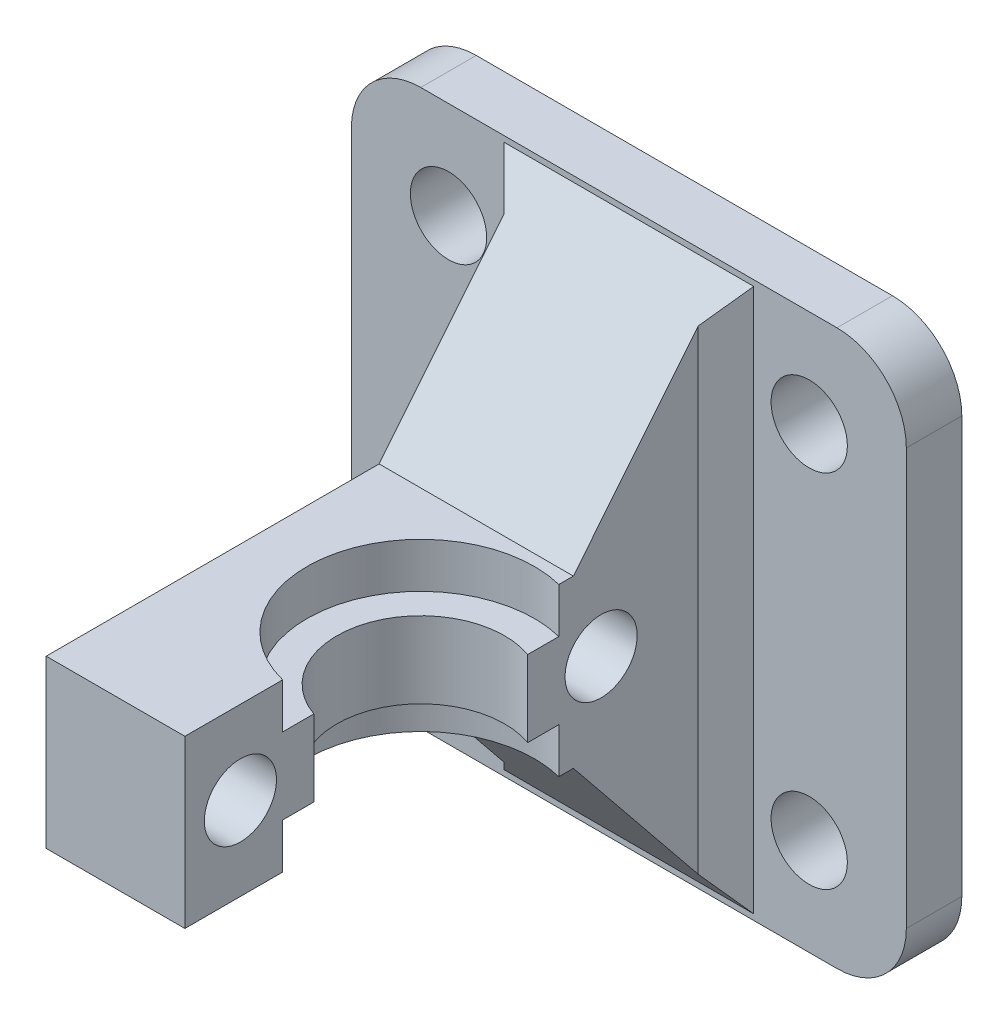
ISO-10303-21;
HEADER;
FILE_DESCRIPTION(('STEP AP214'),'2;1');
FILE_NAME('part.step','',(''),(''),'','','');
FILE_SCHEMA(('AUTOMOTIVE_DESIGN { 1 0 10303 214 1 1 1 1 }'));
ENDSEC;
DATA;
#1=APPLICATION_CONTEXT('core data for automotive mechanical design processes');
#2=APPLICATION_PROTOCOL_DEFINITION('international standard','automotive_design',2000,#1);
#3=PRODUCT_CONTEXT('',#1,'mechanical');
#4=PRODUCT('Part','Part','',(#3));
#5=PRODUCT_RELATED_PRODUCT_CATEGORY('part','',(#4));
#6=PRODUCT_DEFINITION_FORMATION('','',#4);
#7=PRODUCT_DEFINITION_CONTEXT('part definition',#1,'design');
#8=PRODUCT_DEFINITION('design','',#6,#7);
#9=PRODUCT_DEFINITION_SHAPE('','',#8);
#10=(LENGTH_UNIT() NAMED_UNIT(*) SI_UNIT(.MILLI.,.METRE.));
#11=(NAMED_UNIT(*) PLANE_ANGLE_UNIT() SI_UNIT($,.RADIAN.));
#12=(NAMED_UNIT(*) SI_UNIT($,.STERADIAN.) SOLID_ANGLE_UNIT());
#13=UNCERTAINTY_MEASURE_WITH_UNIT(LENGTH_MEASURE(1.E-05),#10,'distance_accuracy_value','');
#14=(GEOMETRIC_REPRESENTATION_CONTEXT(3) GLOBAL_UNCERTAINTY_ASSIGNED_CONTEXT((#13)) GLOBAL_UNIT_ASSIGNED_CONTEXT((#10,
#11,#12)) REPRESENTATION_CONTEXT('',''));
#15=CARTESIAN_POINT('',(0.,0.,0.));
#16=DIRECTION('',(0.,0.,1.));
#17=DIRECTION('',(1.,0.,0.));
#18=AXIS2_PLACEMENT_3D('',#15,#16,#17);
#19=CARTESIAN_POINT('',(5.,6.,24.));
#20=DIRECTION('',(0.,-1.,0.));
#21=DIRECTION('',(0.,0.,-1.));
#22=AXIS2_PLACEMENT_3D('',#19,#20,#21);
#23=CYLINDRICAL_SURFACE('',#22,8.2);
#24=CARTESIAN_POINT('',(5.,-2.75,24.));
#25=DIRECTION('',(0.,1.,0.));
#26=DIRECTION('',(0.,0.,1.));
#27=AXIS2_PLACEMENT_3D('',#24,#25,#26);
#28=CIRCLE('',#27,8.2);
#29=CARTESIAN_POINT('',(3.00000000000001,-2.75,31.9523581408284));
#30=VERTEX_POINT('',#29);
#31=CARTESIAN_POINT('',(7.,-2.75,16.0476418591716));
#32=VERTEX_POINT('',#31);
#33=EDGE_CURVE('E204',#30,#32,#28,.F.);
#34=ORIENTED_EDGE('',*,*,#33,.F.);
#35=DIRECTION('',(0.,-1.,0.));
#36=VECTOR('',#35,1.);
#37=CARTESIAN_POINT('',(3.00000000000001,6.,31.9523581408284));
#38=LINE('',#37,#36);
#39=CARTESIAN_POINT('',(3.00000000000001,-6.,31.9523581408284));
#40=VERTEX_POINT('',#39);
#41=EDGE_CURVE('E261',#30,#40,#38,.T.);
#42=ORIENTED_EDGE('',*,*,#41,.T.);
#43=CARTESIAN_POINT('',(5.,-6.,24.));
#44=DIRECTION('',(0.,-1.,0.));
#45=DIRECTION('',(0.,0.,1.));
#46=AXIS2_PLACEMENT_3D('',#43,#44,#45);
#47=CIRCLE('',#46,8.2);
#48=CARTESIAN_POINT('',(7.,-6.,16.0476418591716));
#49=VERTEX_POINT('',#48);
#50=EDGE_CURVE('E253',#40,#49,#47,.T.);
#51=ORIENTED_EDGE('',*,*,#50,.T.);
#52=DIRECTION('',(0.,-1.,0.));
#53=VECTOR('',#52,1.);
#54=CARTESIAN_POINT('',(7.,6.,16.0476418591716));
#55=LINE('',#54,#53);
#56=EDGE_CURVE('E246',#32,#49,#55,.T.);
#57=ORIENTED_EDGE('',*,*,#56,.F.);
#58=EDGE_LOOP('',(#34,#42,#51,#57));
#59=FACE_BOUND('',#58,.T.);
#60=ADVANCED_FACE('F33',(#59),#23,.F.);
#61=CARTESIAN_POINT('',(-7.,0.,13.));
#62=DIRECTION('',(1.,0.,0.));
#63=DIRECTION('',(0.,0.,-1.));
#64=AXIS2_PLACEMENT_3D('',#61,#62,#63);
#65=CYLINDRICAL_SURFACE('',#64,2.6);
#66=CARTESIAN_POINT('',(-7.,0.,13.));
#67=DIRECTION('',(1.,0.,0.));
#68=DIRECTION('',(0.,0.,-1.));
#69=AXIS2_PLACEMENT_3D('',#66,#67,#68);
#70=CIRCLE('',#69,2.6);
#71=CARTESIAN_POINT('',(-7.,0.,10.4));
#72=VERTEX_POINT('',#71);
#73=EDGE_CURVE('E227',#72,#72,#70,.T.);
#74=ORIENTED_EDGE('',*,*,#73,.F.);
#75=EDGE_LOOP('',(#74));
#76=FACE_BOUND('',#75,.T.);
#77=CARTESIAN_POINT('',(7.,0.,13.));
#78=DIRECTION('',(1.,0.,0.));
#79=DIRECTION('',(0.,0.,-1.));
#80=AXIS2_PLACEMENT_3D('',#77,#78,#79);
#81=CIRCLE('',#80,2.6);
#82=CARTESIAN_POINT('',(7.,0.,10.4));
#83=VERTEX_POINT('',#82);
#84=EDGE_CURVE('E231',#83,#83,#81,.T.);
#85=ORIENTED_EDGE('',*,*,#84,.T.);
#86=EDGE_LOOP('',(#85));
#87=FACE_BOUND('',#86,.T.);
#88=CARTESIAN_POINT('',(3.70000000000004,0.,15.6));
#89=CARTESIAN_POINT('',(3.70000266711035,0.0246446385520677,15.5999994858206));
#90=CARTESIAN_POINT('',(3.70228665332227,0.0493029766518838,15.5996451391014));
#91=CARTESIAN_POINT('',(3.7111974815542,0.0978061832979912,15.5982735696307));
#92=CARTESIAN_POINT('',(3.71782939200899,0.121650068254081,15.5972555732615));
#93=CARTESIAN_POINT('',(3.73478093359689,0.167721413711001,15.5946866605523));
#94=CARTESIAN_POINT('',(3.74507166867469,0.18995994235702,15.5931399235997));
#95=CARTESIAN_POINT('',(3.76865895936663,0.23272295071679,15.5896526800661));
#96=CARTESIAN_POINT('',(3.78195654391533,0.253246840386271,15.5877120387155));
#97=CARTESIAN_POINT('',(3.82032584808766,0.305253555135389,15.5822245452235));
#98=CARTESIAN_POINT('',(3.84743823797105,0.335204653877232,15.5784526270009));
#99=CARTESIAN_POINT('',(3.90594045527389,0.390554954343029,15.5706514688819));
#100=CARTESIAN_POINT('',(3.93734337494103,0.415939650404897,15.566621462258));
#101=CARTESIAN_POINT('',(4.02515134468757,0.478472467646816,15.555907024401));
#102=CARTESIAN_POINT('',(4.08412697352073,0.511997711192338,15.5492666925414));
#103=CARTESIAN_POINT('',(4.20635063739925,0.570056355504465,15.5369066139386));
#104=CARTESIAN_POINT('',(4.26960732409404,0.594570862394637,15.5311888154973));
#105=CARTESIAN_POINT('',(4.44149399094251,0.65004419576083,15.5176895771876));
#106=CARTESIAN_POINT('',(4.55233408181402,0.674454695045524,15.5110628594));
#107=CARTESIAN_POINT('',(4.7766314996914,0.706608431328433,15.5021860240456));
#108=CARTESIAN_POINT('',(4.89009537969944,0.714304017630115,15.4999484206722));
#109=CARTESIAN_POINT('',(5.12229324478594,0.71396883979046,15.5000554958552));
#110=CARTESIAN_POINT('',(5.24103209177177,0.705206499796562,15.5026133283509));
#111=CARTESIAN_POINT('',(5.41652582320383,0.6781764213266,15.5100087137989));
#112=CARTESIAN_POINT('',(5.47449062289461,0.66688321653117,15.5130586724157));
#113=CARTESIAN_POINT('',(5.58910378443032,0.639198328721435,15.5202455099649));
#114=CARTESIAN_POINT('',(5.64575334433879,0.622811498438386,15.5243813537871));
#115=CARTESIAN_POINT('',(5.74857198642842,0.587138068771593,15.5328937628555));
#116=CARTESIAN_POINT('',(5.79503164697384,0.568663334269773,15.5371396087686));
#117=CARTESIAN_POINT('',(5.88579619989819,0.526820491825865,15.5461580607854));
#118=CARTESIAN_POINT('',(5.93009690279299,0.503443302846257,15.5509316365575));
#119=CARTESIAN_POINT('',(6.01574848190205,0.450613010832115,15.5607977001414));
#120=CARTESIAN_POINT('',(6.05705358677998,0.421084955973537,15.5658935240709));
#121=CARTESIAN_POINT('',(6.13369806208265,0.355066674843864,15.5758560511966));
#122=CARTESIAN_POINT('',(6.16906584958734,0.318611502706494,15.580723760424));
#123=CARTESIAN_POINT('',(6.21524615531826,0.257468421027484,15.5873048949636));
#124=CARTESIAN_POINT('',(6.22968243270645,0.235566068968109,15.5894085906244));
#125=CARTESIAN_POINT('',(6.25510879554287,0.189787058994486,15.5931655494481));
#126=CARTESIAN_POINT('',(6.26610121078474,0.165911749676084,15.5948191170257));
#127=CARTESIAN_POINT('',(6.28388688228515,0.116301470061408,15.5975171316654));
#128=CARTESIAN_POINT('',(6.29063612343278,0.0905500027884597,15.5985551878422));
#129=CARTESIAN_POINT('',(6.29904058249715,0.0382106245730077,15.5998504050423));
#130=CARTESIAN_POINT('',(6.30070104639114,0.0116236035892148,15.6001083702512));
#131=CARTESIAN_POINT('',(6.29887056882852,-0.0380731569205889,15.5998253253242));
#132=CARTESIAN_POINT('',(6.29598820081816,-0.0612083206831745,15.5993786975264));
#133=CARTESIAN_POINT('',(6.28643813542854,-0.106660739262427,15.5979109788073));
#134=CARTESIAN_POINT('',(6.27976842690653,-0.12897755281286,15.5968895826769));
#135=CARTESIAN_POINT('',(6.26101576181098,-0.177859143658967,15.594052748741));
#136=CARTESIAN_POINT('',(6.24798432530818,-0.204049582857031,15.592101002369));
#137=CARTESIAN_POINT('',(6.21789815965699,-0.253949305314392,15.5876902125312));
#138=CARTESIAN_POINT('',(6.20083612848259,-0.277653971341187,15.5852302493814));
#139=CARTESIAN_POINT('',(6.15453441868819,-0.333627827481036,15.5787277714951));
#140=CARTESIAN_POINT('',(6.12344521303143,-0.364335233239077,15.5745042451843));
#141=CARTESIAN_POINT('',(6.05698337493439,-0.420630820405962,15.5659070513656));
#142=CARTESIAN_POINT('',(6.02160064247138,-0.446206540238347,15.5615330478818));
#143=CARTESIAN_POINT('',(5.92213134412991,-0.509411670240929,15.5499336673464));
#144=CARTESIAN_POINT('',(5.85537805042234,-0.542846011862888,15.5428694577233));
#145=CARTESIAN_POINT('',(5.71768049284909,-0.599658985099565,15.5300667977269));
#146=CARTESIAN_POINT('',(5.64672803788713,-0.623017173688397,15.5243310534235));
#147=CARTESIAN_POINT('',(5.51670520338476,-0.657572868652399,15.5155208162479));
#148=CARTESIAN_POINT('',(5.45804161556919,-0.670258406185354,15.5121448070635));
#149=CARTESIAN_POINT('',(5.33980979546832,-0.690741344057659,15.5065880688304));
#150=CARTESIAN_POINT('',(5.28024110858591,-0.698536198876264,15.5044079623038));
#151=CARTESIAN_POINT('',(5.10044123600596,-0.715137062163548,15.499750618356));
#152=CARTESIAN_POINT('',(4.97942801978185,-0.717081836711884,15.4991779653655));
#153=CARTESIAN_POINT('',(4.79698794200043,-0.706407605688524,15.5021950705903));
#154=CARTESIAN_POINT('',(4.73504050665241,-0.700375530704898,15.5039061798466));
#155=CARTESIAN_POINT('',(4.61190487087694,-0.683228763101747,15.5086419900749));
#156=CARTESIAN_POINT('',(4.55071625158819,-0.672117015574107,15.5116659298432));
#157=CARTESIAN_POINT('',(4.43005436525828,-0.644413257281783,15.5189153544298));
#158=CARTESIAN_POINT('',(4.37057283403123,-0.627855540388093,15.5231332978862));
#159=CARTESIAN_POINT('',(4.25385495532783,-0.588470701840785,15.5326110043088));
#160=CARTESIAN_POINT('',(4.19661472162409,-0.565655036050854,15.5378688587451));
#161=CARTESIAN_POINT('',(4.10589247018947,-0.522180572291755,15.5470810797948));
#162=CARTESIAN_POINT('',(4.07132543186498,-0.503742575664736,15.5508162531238));
#163=CARTESIAN_POINT('',(4.00423513743781,-0.463362068038479,15.5584604683142));
#164=CARTESIAN_POINT('',(3.97171401903171,-0.441415973623528,15.5623696849777));
#165=CARTESIAN_POINT('',(3.90939509969128,-0.393304192473495,15.5701971519027));
#166=CARTESIAN_POINT('',(3.87962686596363,-0.367099537587357,15.5741151201549));
#167=CARTESIAN_POINT('',(3.82473921050896,-0.310131578920839,15.5815960872351));
#168=CARTESIAN_POINT('',(3.79960800705441,-0.279380196204407,15.5851599747578));
#169=CARTESIAN_POINT('',(3.76413655062274,-0.225227087124255,15.5903127405192));
#170=CARTESIAN_POINT('',(3.75173702375318,-0.203202245365268,15.5921492339267));
#171=CARTESIAN_POINT('',(3.73051096100129,-0.157465050800809,15.5953279095812));
#172=CARTESIAN_POINT('',(3.72167775420576,-0.133755947113204,15.5966710142987));
#173=CARTESIAN_POINT('',(3.7100767482343,-0.0916532261959274,15.5984452222065));
#174=CARTESIAN_POINT('',(3.70631804463677,-0.0735368951870844,15.5990242474313));
#175=CARTESIAN_POINT('',(3.70127857406311,-0.036949628459925,15.5998018439192));
#176=CARTESIAN_POINT('',(3.69999800018826,-0.0184786652211387,15.6000003855341));
#177=CARTESIAN_POINT('',(3.70000000000004,0.,15.6));
#178=B_SPLINE_CURVE_WITH_KNOTS('',3,(#88,#89,#90,#91,#92,#93,#94,#95,#96,#97,#98,#99,#100,#101,
#102,#103,#104,#105,#106,#107,#108,#109,#110,#111,#112,#113,#114,#115,#116,#117,#118,#119,#120,
#121,#122,#123,#124,#125,#126,#127,#128,#129,#130,#131,#132,#133,#134,#135,#136,#137,#138,#139,
#140,#141,#142,#143,#144,#145,#146,#147,#148,#149,#150,#151,#152,#153,#154,#155,#156,#157,#158,
#159,#160,#161,#162,#163,#164,#165,#166,#167,#168,#169,#170,#171,#172,#173,#174,#175,#176,#177),
.UNSPECIFIED.,.T.,.F.,(4,2,2,2,2,2,2,2,2,2,2,2,2,2,2,2,2,2,2,2,2,2,2,2,2,2,2,2,2,2,2,2,2,2,2,2,
2,2,2,2,2,2,2,2,4),(0.,0.0738559209400195,0.147798090186888,0.221168809397196,0.294564673938246,
0.415591611305624,0.5369964639744,0.740334957731089,0.944097415419544,1.28330637190744,
1.62348107937878,1.97913570584439,2.15635512205151,2.33340621495194,2.48371439072381,
2.63430348804519,2.78684792182428,2.9386400391484,3.01734655899313,3.09599971784728,
3.17545585083391,3.25483004556811,3.32444001364924,3.39408698043023,3.48155640916668,
3.5691855338482,3.70014981419978,3.83142837309955,4.05515514549684,4.27933371570412,
4.45943339526073,4.63962673617629,5.00096902586841,5.1876029674382,5.37412883937237,
5.55950193294432,5.74453791981373,5.86243992775728,5.98046314780498,6.09963439825919,
6.2184985595714,6.2942727831185,6.36990460452187,6.42527780475544,6.48065531961597),.UNSPECIFIED.);
#179=CARTESIAN_POINT('',(3.70000000000004,0.,15.6));
#180=VERTEX_POINT('',#179);
#181=EDGE_CURVE('E334',#180,#180,#178,.T.);
#182=ORIENTED_EDGE('',*,*,#181,.F.);
#183=EDGE_LOOP('',(#182));
#184=FACE_BOUND('',#183,.T.);
#185=ADVANCED_FACE('F345',(#76,#87,#184),#65,.F.);
#186=CARTESIAN_POINT('',(20.,20.,4.));
#187=DIRECTION('',(-1.,0.,0.));
#188=DIRECTION('',(0.,-1.,0.));
#189=AXIS2_PLACEMENT_3D('',#186,#187,#188);
#190=PLANE('',#189);
#191=DIRECTION('',(0.,1.,0.));
#192=VECTOR('',#191,1.);
#193=CARTESIAN_POINT('',(20.,20.,4.));
#194=LINE('',#193,#192);
#195=CARTESIAN_POINT('',(20.,-15.,4.));
#196=VERTEX_POINT('',#195);
#197=CARTESIAN_POINT('',(20.,15.,4.));
#198=VERTEX_POINT('',#197);
#199=EDGE_CURVE('E295',#196,#198,#194,.T.);
#200=ORIENTED_EDGE('',*,*,#199,.F.);
#201=DIRECTION('',(0.,0.,-1.));
#202=VECTOR('',#201,1.);
#203=CARTESIAN_POINT('',(20.,-15.,4.));
#204=LINE('',#203,#202);
#205=CARTESIAN_POINT('',(20.,-15.,0.));
#206=VERTEX_POINT('',#205);
#207=EDGE_CURVE('E465',#196,#206,#204,.T.);
#208=ORIENTED_EDGE('',*,*,#207,.T.);
#209=DIRECTION('',(0.,1.,0.));
#210=VECTOR('',#209,1.);
#211=CARTESIAN_POINT('',(20.,20.,0.));
#212=LINE('',#211,#210);
#213=CARTESIAN_POINT('',(20.,15.,0.));
#214=VERTEX_POINT('',#213);
#215=EDGE_CURVE('E294',#206,#214,#212,.T.);
#216=ORIENTED_EDGE('',*,*,#215,.T.);
#217=DIRECTION('',(0.,0.,-1.));
#218=VECTOR('',#217,1.);
#219=CARTESIAN_POINT('',(20.,15.,4.));
#220=LINE('',#219,#218);
#221=EDGE_CURVE('E463',#214,#198,#220,.F.);
#222=ORIENTED_EDGE('',*,*,#221,.T.);
#223=EDGE_LOOP('',(#200,#208,#216,#222));
#224=FACE_BOUND('',#223,.T.);
#225=ADVANCED_FACE('F374',(#224),#190,.F.);
#226=CARTESIAN_POINT('',(-20.,20.,4.));
#227=DIRECTION('',(0.,-1.,0.));
#228=DIRECTION('',(0.,0.,-1.));
#229=AXIS2_PLACEMENT_3D('',#226,#227,#228);
#230=PLANE('',#229);
#231=DIRECTION('',(-1.,0.,0.));
#232=VECTOR('',#231,1.);
#233=CARTESIAN_POINT('',(-20.,20.,4.));
#234=LINE('',#233,#232);
#235=CARTESIAN_POINT('',(15.,20.,4.));
#236=VERTEX_POINT('',#235);
#237=CARTESIAN_POINT('',(-15.,20.,4.));
#238=VERTEX_POINT('',#237);
#239=EDGE_CURVE('E297',#236,#238,#234,.T.);
#240=ORIENTED_EDGE('',*,*,#239,.F.);
#241=DIRECTION('',(0.,0.,-1.));
#242=VECTOR('',#241,1.);
#243=CARTESIAN_POINT('',(15.,20.,4.));
#244=LINE('',#243,#242);
#245=CARTESIAN_POINT('',(15.,20.,0.));
#246=VERTEX_POINT('',#245);
#247=EDGE_CURVE('E11',#236,#246,#244,.T.);
#248=ORIENTED_EDGE('',*,*,#247,.T.);
#249=DIRECTION('',(-1.,0.,0.));
#250=VECTOR('',#249,1.);
#251=CARTESIAN_POINT('',(-20.,20.,0.));
#252=LINE('',#251,#250);
#253=CARTESIAN_POINT('',(-15.,20.,0.));
#254=VERTEX_POINT('',#253);
#255=EDGE_CURVE('E309',#246,#254,#252,.T.);
#256=ORIENTED_EDGE('',*,*,#255,.T.);
#257=DIRECTION('',(0.,0.,-1.));
#258=VECTOR('',#257,1.);
#259=CARTESIAN_POINT('',(-15.,20.,4.));
#260=LINE('',#259,#258);
#261=EDGE_CURVE('E41',#254,#238,#260,.F.);
#262=ORIENTED_EDGE('',*,*,#261,.T.);
#263=EDGE_LOOP('',(#240,#248,#256,#262));
#264=FACE_BOUND('',#263,.T.);
#265=ADVANCED_FACE('F481',(#264),#230,.F.);
#266=CARTESIAN_POINT('',(-20.,20.,4.));
#267=DIRECTION('',(1.,0.,0.));
#268=DIRECTION('',(0.,1.,0.));
#269=AXIS2_PLACEMENT_3D('',#266,#267,#268);
#270=PLANE('',#269);
#271=DIRECTION('',(0.,-1.,0.));
#272=VECTOR('',#271,1.);
#273=CARTESIAN_POINT('',(-20.,20.,0.));
#274=LINE('',#273,#272);
#275=CARTESIAN_POINT('',(-20.,15.,0.));
#276=VERTEX_POINT('',#275);
#277=CARTESIAN_POINT('',(-20.,-15.,0.));
#278=VERTEX_POINT('',#277);
#279=EDGE_CURVE('E311',#276,#278,#274,.T.);
#280=ORIENTED_EDGE('',*,*,#279,.T.);
#281=DIRECTION('',(0.,0.,-1.));
#282=VECTOR('',#281,1.);
#283=CARTESIAN_POINT('',(-20.,-15.,4.));
#284=LINE('',#283,#282);
#285=CARTESIAN_POINT('',(-20.,-15.,4.));
#286=VERTEX_POINT('',#285);
#287=EDGE_CURVE('E454',#278,#286,#284,.F.);
#288=ORIENTED_EDGE('',*,*,#287,.T.);
#289=DIRECTION('',(0.,-1.,0.));
#290=VECTOR('',#289,1.);
#291=CARTESIAN_POINT('',(-20.,20.,4.));
#292=LINE('',#291,#290);
#293=CARTESIAN_POINT('',(-20.,15.,4.));
#294=VERTEX_POINT('',#293);
#295=EDGE_CURVE('E300',#294,#286,#292,.T.);
#296=ORIENTED_EDGE('',*,*,#295,.F.);
#297=DIRECTION('',(0.,0.,-1.));
#298=VECTOR('',#297,1.);
#299=CARTESIAN_POINT('',(-20.,15.,4.));
#300=LINE('',#299,#298);
#301=EDGE_CURVE('E451',#294,#276,#300,.T.);
#302=ORIENTED_EDGE('',*,*,#301,.T.);
#303=EDGE_LOOP('',(#280,#288,#296,#302));
#304=FACE_BOUND('',#303,.T.);
#305=ADVANCED_FACE('F489',(#304),#270,.F.);
#306=CARTESIAN_POINT('',(-20.,-20.,4.));
#307=DIRECTION('',(0.,1.,0.));
#308=DIRECTION('',(-1.,0.,0.));
#309=AXIS2_PLACEMENT_3D('',#306,#307,#308);
#310=PLANE('',#309);
#311=DIRECTION('',(1.,0.,0.));
#312=VECTOR('',#311,1.);
#313=CARTESIAN_POINT('',(-20.,-20.,4.));
#314=LINE('',#313,#312);
#315=CARTESIAN_POINT('',(-15.,-20.,4.));
#316=VERTEX_POINT('',#315);
#317=CARTESIAN_POINT('',(15.,-20.,4.));
#318=VERTEX_POINT('',#317);
#319=EDGE_CURVE('E303',#316,#318,#314,.T.);
#320=ORIENTED_EDGE('',*,*,#319,.F.);
#321=DIRECTION('',(0.,0.,-1.));
#322=VECTOR('',#321,1.);
#323=CARTESIAN_POINT('',(-15.,-20.,4.));
#324=LINE('',#323,#322);
#325=CARTESIAN_POINT('',(-15.,-20.,0.));
#326=VERTEX_POINT('',#325);
#327=EDGE_CURVE('E440',#316,#326,#324,.T.);
#328=ORIENTED_EDGE('',*,*,#327,.T.);
#329=DIRECTION('',(1.,0.,0.));
#330=VECTOR('',#329,1.);
#331=CARTESIAN_POINT('',(-20.,-20.,0.));
#332=LINE('',#331,#330);
#333=CARTESIAN_POINT('',(15.,-20.,0.));
#334=VERTEX_POINT('',#333);
#335=EDGE_CURVE('E298',#326,#334,#332,.T.);
#336=ORIENTED_EDGE('',*,*,#335,.T.);
#337=DIRECTION('',(0.,0.,-1.));
#338=VECTOR('',#337,1.);
#339=CARTESIAN_POINT('',(15.,-20.,4.));
#340=LINE('',#339,#338);
#341=EDGE_CURVE('E438',#334,#318,#340,.F.);
#342=ORIENTED_EDGE('',*,*,#341,.T.);
#343=EDGE_LOOP('',(#320,#328,#336,#342));
#344=FACE_BOUND('',#343,.T.);
#345=ADVANCED_FACE('F497',(#344),#310,.F.);
#346=CARTESIAN_POINT('',(0.,0.,4.));
#347=DIRECTION('',(0.,0.,1.));
#348=DIRECTION('',(1.,0.,0.));
#349=AXIS2_PLACEMENT_3D('',#346,#347,#348);
#350=PLANE('',#349);
#351=DIRECTION('',(0.,-1.,0.));
#352=VECTOR('',#351,1.);
#353=CARTESIAN_POINT('',(9.00000000000001,0.,4.));
#354=LINE('',#353,#352);
#355=CARTESIAN_POINT('',(9.00000000000001,19.5838687218857,4.));
#356=VERTEX_POINT('',#355);
#357=CARTESIAN_POINT('',(9.00000000000001,-19.5838687218857,4.));
#358=VERTEX_POINT('',#357);
#359=EDGE_CURVE('E432',#356,#358,#354,.T.);
#360=ORIENTED_EDGE('',*,*,#359,.T.);
#361=DIRECTION('',(-1.,0.,0.));
#362=VECTOR('',#361,1.);
#363=CARTESIAN_POINT('',(0.,-19.5838687218857,4.));
#364=LINE('',#363,#362);
#365=CARTESIAN_POINT('',(-8.99999999999998,-19.5838687218857,4.));
#366=VERTEX_POINT('',#365);
#367=EDGE_CURVE('E317',#358,#366,#364,.T.);
#368=ORIENTED_EDGE('',*,*,#367,.T.);
#369=DIRECTION('',(0.,1.,0.));
#370=VECTOR('',#369,1.);
#371=CARTESIAN_POINT('',(-8.99999999999998,0.,4.));
#372=LINE('',#371,#370);
#373=CARTESIAN_POINT('',(-8.99999999999998,19.5838687218857,4.));
#374=VERTEX_POINT('',#373);
#375=EDGE_CURVE('E343',#366,#374,#372,.T.);
#376=ORIENTED_EDGE('',*,*,#375,.T.);
#377=DIRECTION('',(1.,0.,0.));
#378=VECTOR('',#377,1.);
#379=CARTESIAN_POINT('',(7.,19.5838687218857,4.));
#380=LINE('',#379,#378);
#381=EDGE_CURVE('E306',#374,#356,#380,.T.);
#382=ORIENTED_EDGE('',*,*,#381,.T.);
#383=EDGE_LOOP('',(#360,#368,#376,#382));
#384=FACE_BOUND('',#383,.T.);
#385=CARTESIAN_POINT('',(-13.,-13.,4.));
#386=DIRECTION('',(0.,0.,1.));
#387=DIRECTION('',(1.,0.,0.));
#388=AXIS2_PLACEMENT_3D('',#385,#386,#387);
#389=CIRCLE('',#388,2.75);
#390=CARTESIAN_POINT('',(-10.25,-13.,4.));
#391=VERTEX_POINT('',#390);
#392=EDGE_CURVE('E273',#391,#391,#389,.T.);
#393=ORIENTED_EDGE('',*,*,#392,.F.);
#394=EDGE_LOOP('',(#393));
#395=FACE_BOUND('',#394,.T.);
#396=CARTESIAN_POINT('',(13.,-13.,4.));
#397=DIRECTION('',(0.,0.,1.));
#398=DIRECTION('',(1.,0.,0.));
#399=AXIS2_PLACEMENT_3D('',#396,#397,#398);
#400=CIRCLE('',#399,2.75);
#401=CARTESIAN_POINT('',(15.75,-13.,4.));
#402=VERTEX_POINT('',#401);
#403=EDGE_CURVE('E279',#402,#402,#400,.T.);
#404=ORIENTED_EDGE('',*,*,#403,.F.);
#405=EDGE_LOOP('',(#404));
#406=FACE_BOUND('',#405,.T.);
#407=CARTESIAN_POINT('',(13.,13.,4.));
#408=DIRECTION('',(0.,0.,1.));
#409=DIRECTION('',(1.,0.,0.));
#410=AXIS2_PLACEMENT_3D('',#407,#408,#409);
#411=CIRCLE('',#410,2.75);
#412=CARTESIAN_POINT('',(15.75,13.,4.));
#413=VERTEX_POINT('',#412);
#414=EDGE_CURVE('E285',#413,#413,#411,.T.);
#415=ORIENTED_EDGE('',*,*,#414,.F.);
#416=EDGE_LOOP('',(#415));
#417=FACE_BOUND('',#416,.T.);
#418=CARTESIAN_POINT('',(-13.,13.,4.));
#419=DIRECTION('',(0.,0.,1.));
#420=DIRECTION('',(1.,0.,0.));
#421=AXIS2_PLACEMENT_3D('',#418,#419,#420);
#422=CIRCLE('',#421,2.75);
#423=CARTESIAN_POINT('',(-10.25,13.,4.));
#424=VERTEX_POINT('',#423);
#425=EDGE_CURVE('E291',#424,#424,#422,.T.);
#426=ORIENTED_EDGE('',*,*,#425,.F.);
#427=EDGE_LOOP('',(#426));
#428=FACE_BOUND('',#427,.T.);
#429=ORIENTED_EDGE('',*,*,#295,.T.);
#430=CARTESIAN_POINT('',(-15.,-15.,4.));
#431=DIRECTION('',(0.,0.,1.));
#432=DIRECTION('',(1.,0.,0.));
#433=AXIS2_PLACEMENT_3D('',#430,#431,#432);
#434=CIRCLE('',#433,5.);
#435=EDGE_CURVE('E461',#286,#316,#434,.T.);
#436=ORIENTED_EDGE('',*,*,#435,.T.);
#437=ORIENTED_EDGE('',*,*,#319,.T.);
#438=CARTESIAN_POINT('',(15.,-15.,4.));
#439=DIRECTION('',(0.,0.,1.));
#440=DIRECTION('',(1.,0.,0.));
#441=AXIS2_PLACEMENT_3D('',#438,#439,#440);
#442=CIRCLE('',#441,5.);
#443=EDGE_CURVE('E459',#318,#196,#442,.T.);
#444=ORIENTED_EDGE('',*,*,#443,.T.);
#445=ORIENTED_EDGE('',*,*,#199,.T.);
#446=CARTESIAN_POINT('',(15.,15.,4.));
#447=DIRECTION('',(0.,0.,1.));
#448=DIRECTION('',(1.,0.,0.));
#449=AXIS2_PLACEMENT_3D('',#446,#447,#448);
#450=CIRCLE('',#449,5.);
#451=EDGE_CURVE('E54',#198,#236,#450,.T.);
#452=ORIENTED_EDGE('',*,*,#451,.T.);
#453=ORIENTED_EDGE('',*,*,#239,.T.);
#454=CARTESIAN_POINT('',(-15.,15.,4.));
#455=DIRECTION('',(0.,0.,1.));
#456=DIRECTION('',(1.,0.,0.));
#457=AXIS2_PLACEMENT_3D('',#454,#455,#456);
#458=CIRCLE('',#457,5.);
#459=EDGE_CURVE('E456',#238,#294,#458,.T.);
#460=ORIENTED_EDGE('',*,*,#459,.T.);
#461=EDGE_LOOP('',(#429,#436,#437,#444,#445,#452,#453,#460));
#462=FACE_BOUND('',#461,.T.);
#463=ADVANCED_FACE('F483',(#384,#395,#406,#417,#428,#462),#350,.T.);
#464=CARTESIAN_POINT('',(0.,0.,0.));
#465=DIRECTION('',(0.,0.,1.));
#466=DIRECTION('',(1.,0.,0.));
#467=AXIS2_PLACEMENT_3D('',#464,#465,#466);
#468=PLANE('',#467);
#469=CARTESIAN_POINT('',(-13.,-13.,0.));
#470=DIRECTION('',(0.,0.,1.));
#471=DIRECTION('',(-1.,0.,0.));
#472=AXIS2_PLACEMENT_3D('',#469,#470,#471);
#473=CIRCLE('',#472,2.75);
#474=CARTESIAN_POINT('',(-15.75,-13.,0.));
#475=VERTEX_POINT('',#474);
#476=EDGE_CURVE('E270',#475,#475,#473,.T.);
#477=ORIENTED_EDGE('',*,*,#476,.T.);
#478=EDGE_LOOP('',(#477));
#479=FACE_BOUND('',#478,.T.);
#480=CARTESIAN_POINT('',(13.,-13.,0.));
#481=DIRECTION('',(0.,0.,1.));
#482=DIRECTION('',(1.,0.,0.));
#483=AXIS2_PLACEMENT_3D('',#480,#481,#482);
#484=CIRCLE('',#483,2.75);
#485=CARTESIAN_POINT('',(15.75,-13.,0.));
#486=VERTEX_POINT('',#485);
#487=EDGE_CURVE('E276',#486,#486,#484,.T.);
#488=ORIENTED_EDGE('',*,*,#487,.T.);
#489=EDGE_LOOP('',(#488));
#490=FACE_BOUND('',#489,.T.);
#491=CARTESIAN_POINT('',(13.,13.,0.));
#492=DIRECTION('',(0.,0.,1.));
#493=DIRECTION('',(-1.,0.,0.));
#494=AXIS2_PLACEMENT_3D('',#491,#492,#493);
#495=CIRCLE('',#494,2.75);
#496=CARTESIAN_POINT('',(10.25,13.,0.));
#497=VERTEX_POINT('',#496);
#498=EDGE_CURVE('E282',#497,#497,#495,.T.);
#499=ORIENTED_EDGE('',*,*,#498,.T.);
#500=EDGE_LOOP('',(#499));
#501=FACE_BOUND('',#500,.T.);
#502=CARTESIAN_POINT('',(-13.,13.,0.));
#503=DIRECTION('',(0.,0.,1.));
#504=DIRECTION('',(1.,0.,0.));
#505=AXIS2_PLACEMENT_3D('',#502,#503,#504);
#506=CIRCLE('',#505,2.75);
#507=CARTESIAN_POINT('',(-10.25,13.,0.));
#508=VERTEX_POINT('',#507);
#509=EDGE_CURVE('E288',#508,#508,#506,.T.);
#510=ORIENTED_EDGE('',*,*,#509,.T.);
#511=EDGE_LOOP('',(#510));
#512=FACE_BOUND('',#511,.T.);
#513=ORIENTED_EDGE('',*,*,#335,.F.);
#514=CARTESIAN_POINT('',(-15.,-15.,0.));
#515=DIRECTION('',(0.,0.,1.));
#516=DIRECTION('',(1.,0.,0.));
#517=AXIS2_PLACEMENT_3D('',#514,#515,#516);
#518=CIRCLE('',#517,5.);
#519=EDGE_CURVE('E449',#326,#278,#518,.F.);
#520=ORIENTED_EDGE('',*,*,#519,.T.);
#521=ORIENTED_EDGE('',*,*,#279,.F.);
#522=CARTESIAN_POINT('',(-15.,15.,0.));
#523=DIRECTION('',(0.,0.,1.));
#524=DIRECTION('',(1.,0.,0.));
#525=AXIS2_PLACEMENT_3D('',#522,#523,#524);
#526=CIRCLE('',#525,5.);
#527=EDGE_CURVE('E443',#276,#254,#526,.F.);
#528=ORIENTED_EDGE('',*,*,#527,.T.);
#529=ORIENTED_EDGE('',*,*,#255,.F.);
#530=CARTESIAN_POINT('',(15.,15.,0.));
#531=DIRECTION('',(0.,0.,1.));
#532=DIRECTION('',(1.,0.,0.));
#533=AXIS2_PLACEMENT_3D('',#530,#531,#532);
#534=CIRCLE('',#533,5.);
#535=EDGE_CURVE('E445',#246,#214,#534,.F.);
#536=ORIENTED_EDGE('',*,*,#535,.T.);
#537=ORIENTED_EDGE('',*,*,#215,.F.);
#538=CARTESIAN_POINT('',(15.,-15.,0.));
#539=DIRECTION('',(0.,0.,1.));
#540=DIRECTION('',(1.,0.,0.));
#541=AXIS2_PLACEMENT_3D('',#538,#539,#540);
#542=CIRCLE('',#541,5.);
#543=EDGE_CURVE('E447',#206,#334,#542,.F.);
#544=ORIENTED_EDGE('',*,*,#543,.T.);
#545=EDGE_LOOP('',(#513,#520,#521,#528,#529,#536,#537,#544));
#546=FACE_BOUND('',#545,.T.);
#547=ADVANCED_FACE('F476',(#479,#490,#501,#512,#546),#468,.F.);
#548=CARTESIAN_POINT('',(-13.,13.,4.001));
#549=DIRECTION('',(0.,0.,-1.));
#550=DIRECTION('',(-1.,0.,0.));
#551=AXIS2_PLACEMENT_3D('',#548,#549,#550);
#552=CYLINDRICAL_SURFACE('',#551,2.75);
#553=ORIENTED_EDGE('',*,*,#425,.T.);
#554=EDGE_LOOP('',(#553));
#555=FACE_BOUND('',#554,.T.);
#556=ORIENTED_EDGE('',*,*,#509,.F.);
#557=EDGE_LOOP('',(#556));
#558=FACE_BOUND('',#557,.T.);
#559=ADVANCED_FACE('F527',(#555,#558),#552,.F.);
#560=CARTESIAN_POINT('',(13.,13.,4.001));
#561=DIRECTION('',(0.,0.,-1.));
#562=DIRECTION('',(-1.,0.,0.));
#563=AXIS2_PLACEMENT_3D('',#560,#561,#562);
#564=CYLINDRICAL_SURFACE('',#563,2.75);
#565=ORIENTED_EDGE('',*,*,#414,.T.);
#566=EDGE_LOOP('',(#565));
#567=FACE_BOUND('',#566,.T.);
#568=ORIENTED_EDGE('',*,*,#498,.F.);
#569=EDGE_LOOP('',(#568));
#570=FACE_BOUND('',#569,.T.);
#571=ADVANCED_FACE('F534',(#567,#570),#564,.F.);
#572=CARTESIAN_POINT('',(13.,-13.,4.001));
#573=DIRECTION('',(0.,0.,-1.));
#574=DIRECTION('',(-1.,0.,0.));
#575=AXIS2_PLACEMENT_3D('',#572,#573,#574);
#576=CYLINDRICAL_SURFACE('',#575,2.75);
#577=ORIENTED_EDGE('',*,*,#403,.T.);
#578=EDGE_LOOP('',(#577));
#579=FACE_BOUND('',#578,.T.);
#580=ORIENTED_EDGE('',*,*,#487,.F.);
#581=EDGE_LOOP('',(#580));
#582=FACE_BOUND('',#581,.T.);
#583=ADVANCED_FACE('F538',(#579,#582),#576,.F.);
#584=CARTESIAN_POINT('',(-13.,-13.,4.001));
#585=DIRECTION('',(0.,0.,-1.));
#586=DIRECTION('',(-1.,0.,0.));
#587=AXIS2_PLACEMENT_3D('',#584,#585,#586);
#588=CYLINDRICAL_SURFACE('',#587,2.75);
#589=ORIENTED_EDGE('',*,*,#392,.T.);
#590=EDGE_LOOP('',(#589));
#591=FACE_BOUND('',#590,.T.);
#592=ORIENTED_EDGE('',*,*,#476,.F.);
#593=EDGE_LOOP('',(#592));
#594=FACE_BOUND('',#593,.T.);
#595=ADVANCED_FACE('F542',(#591,#594),#588,.F.);
#596=CARTESIAN_POINT('',(-7.,6.,4.));
#597=DIRECTION('',(1.,0.,0.));
#598=DIRECTION('',(0.,0.,-1.));
#599=AXIS2_PLACEMENT_3D('',#596,#597,#598);
#600=PLANE('',#599);
#601=CARTESIAN_POINT('',(-7.,0.,35.));
#602=DIRECTION('',(1.,0.,0.));
#603=DIRECTION('',(0.,0.,-1.));
#604=AXIS2_PLACEMENT_3D('',#601,#602,#603);
#605=CIRCLE('',#604,2.6);
#606=CARTESIAN_POINT('',(-7.,0.,32.4));
#607=VERTEX_POINT('',#606);
#608=EDGE_CURVE('E223',#607,#607,#605,.T.);
#609=ORIENTED_EDGE('',*,*,#608,.T.);
#610=EDGE_LOOP('',(#609));
#611=FACE_BOUND('',#610,.T.);
#612=ORIENTED_EDGE('',*,*,#73,.T.);
#613=EDGE_LOOP('',(#612));
#614=FACE_BOUND('',#613,.T.);
#615=DIRECTION('',(0.,-0.777145961456974,0.629320391049833));
#616=VECTOR('',#615,1.);
#617=CARTESIAN_POINT('',(-7.,11.3798118040359,10.6435142994977));
#618=LINE('',#617,#616);
#619=CARTESIAN_POINT('',(-7.,6.,15.));
#620=VERTEX_POINT('',#619);
#621=CARTESIAN_POINT('',(-7.,17.1140744088155,6.));
#622=VERTEX_POINT('',#621);
#623=EDGE_CURVE('E329',#620,#622,#618,.F.);
#624=ORIENTED_EDGE('',*,*,#623,.T.);
#625=DIRECTION('',(0.,-1.,0.));
#626=VECTOR('',#625,1.);
#627=CARTESIAN_POINT('',(-7.,6.,6.));
#628=LINE('',#627,#626);
#629=CARTESIAN_POINT('',(-7.,-17.1140744088155,6.));
#630=VERTEX_POINT('',#629);
#631=EDGE_CURVE('E420',#622,#630,#628,.T.);
#632=ORIENTED_EDGE('',*,*,#631,.T.);
#633=DIRECTION('',(0.,0.777145961456974,0.629320391049833));
#634=VECTOR('',#633,1.);
#635=CARTESIAN_POINT('',(-7.,-4.13234165912928,16.5123999039005));
#636=LINE('',#635,#634);
#637=CARTESIAN_POINT('',(-7.,-6.,15.));
#638=VERTEX_POINT('',#637);
#639=EDGE_CURVE('E324',#630,#638,#636,.T.);
#640=ORIENTED_EDGE('',*,*,#639,.T.);
#641=DIRECTION('',(0.,0.,1.));
#642=VECTOR('',#641,1.);
#643=CARTESIAN_POINT('',(-7.,-6.,4.));
#644=LINE('',#643,#642);
#645=CARTESIAN_POINT('',(-7.,-6.,39.));
#646=VERTEX_POINT('',#645);
#647=EDGE_CURVE('E230',#638,#646,#644,.T.);
#648=ORIENTED_EDGE('',*,*,#647,.T.);
#649=DIRECTION('',(0.,-1.,0.));
#650=VECTOR('',#649,1.);
#651=CARTESIAN_POINT('',(-7.,6.,39.));
#652=LINE('',#651,#650);
#653=CARTESIAN_POINT('',(-7.,6.,39.));
#654=VERTEX_POINT('',#653);
#655=EDGE_CURVE('E267',#654,#646,#652,.T.);
#656=ORIENTED_EDGE('',*,*,#655,.F.);
#657=DIRECTION('',(0.,0.,1.));
#658=VECTOR('',#657,1.);
#659=CARTESIAN_POINT('',(-7.,6.,4.));
#660=LINE('',#659,#658);
#661=EDGE_CURVE('E234',#620,#654,#660,.T.);
#662=ORIENTED_EDGE('',*,*,#661,.F.);
#663=EDGE_LOOP('',(#624,#632,#640,#648,#656,#662));
#664=FACE_BOUND('',#663,.T.);
#665=ADVANCED_FACE('F419',(#611,#614,#664),#600,.F.);
#666=CARTESIAN_POINT('',(-7.,6.,39.));
#667=DIRECTION('',(0.,0.,-1.));
#668=DIRECTION('',(-1.,0.,0.));
#669=AXIS2_PLACEMENT_3D('',#666,#667,#668);
#670=PLANE('',#669);
#671=DIRECTION('',(1.,0.,0.));
#672=VECTOR('',#671,1.);
#673=CARTESIAN_POINT('',(-7.,-6.,39.));
#674=LINE('',#673,#672);
#675=CARTESIAN_POINT('',(3.,-6.,39.));
#676=VERTEX_POINT('',#675);
#677=EDGE_CURVE('E248',#646,#676,#674,.T.);
#678=ORIENTED_EDGE('',*,*,#677,.T.);
#679=DIRECTION('',(0.,-1.,0.));
#680=VECTOR('',#679,1.);
#681=CARTESIAN_POINT('',(3.,6.,39.));
#682=LINE('',#681,#680);
#683=CARTESIAN_POINT('',(3.,6.,39.));
#684=VERTEX_POINT('',#683);
#685=EDGE_CURVE('E264',#684,#676,#682,.T.);
#686=ORIENTED_EDGE('',*,*,#685,.F.);
#687=DIRECTION('',(1.,0.,0.));
#688=VECTOR('',#687,1.);
#689=CARTESIAN_POINT('',(-7.,6.,39.));
#690=LINE('',#689,#688);
#691=EDGE_CURVE('E236',#654,#684,#690,.T.);
#692=ORIENTED_EDGE('',*,*,#691,.F.);
#693=ORIENTED_EDGE('',*,*,#655,.T.);
#694=EDGE_LOOP('',(#678,#686,#692,#693));
#695=FACE_BOUND('',#694,.T.);
#696=ADVANCED_FACE('F387',(#695),#670,.F.);
#697=CARTESIAN_POINT('',(3.,6.,39.));
#698=DIRECTION('',(-1.,0.,0.));
#699=DIRECTION('',(0.,0.,1.));
#700=AXIS2_PLACEMENT_3D('',#697,#698,#699);
#701=PLANE('',#700);
#702=DIRECTION('',(0.,0.,-1.));
#703=VECTOR('',#702,1.);
#704=CARTESIAN_POINT('',(3.,2.75,29.7098598932023));
#705=LINE('',#704,#703);
#706=CARTESIAN_POINT('',(3.00000000000001,2.75,31.9523581408284));
#707=VERTEX_POINT('',#706);
#708=CARTESIAN_POINT('',(3.,2.75,29.7098598932023));
#709=VERTEX_POINT('',#708);
#710=EDGE_CURVE('E183',#707,#709,#705,.T.);
#711=ORIENTED_EDGE('',*,*,#710,.F.);
#712=CARTESIAN_POINT('',(3.00000000000001,6.,31.9523581408284));
#713=VERTEX_POINT('',#712);
#714=EDGE_CURVE('E262',#713,#707,#38,.T.);
#715=ORIENTED_EDGE('',*,*,#714,.F.);
#716=DIRECTION('',(0.,0.,-1.));
#717=VECTOR('',#716,1.);
#718=CARTESIAN_POINT('',(3.,6.,39.));
#719=LINE('',#718,#717);
#720=EDGE_CURVE('E239',#684,#713,#719,.T.);
#721=ORIENTED_EDGE('',*,*,#720,.F.);
#722=ORIENTED_EDGE('',*,*,#685,.T.);
#723=DIRECTION('',(0.,0.,-1.));
#724=VECTOR('',#723,1.);
#725=CARTESIAN_POINT('',(3.,-6.,39.));
#726=LINE('',#725,#724);
#727=EDGE_CURVE('E250',#676,#40,#726,.T.);
#728=ORIENTED_EDGE('',*,*,#727,.T.);
#729=ORIENTED_EDGE('',*,*,#41,.F.);
#730=DIRECTION('',(0.,0.,-1.));
#731=VECTOR('',#730,1.);
#732=CARTESIAN_POINT('',(3.,-2.75,29.7098598932023));
#733=LINE('',#732,#731);
#734=CARTESIAN_POINT('',(3.,-2.75,29.7098598932023));
#735=VERTEX_POINT('',#734);
#736=EDGE_CURVE('E201',#30,#735,#733,.T.);
#737=ORIENTED_EDGE('',*,*,#736,.T.);
#738=DIRECTION('',(0.,-1.,0.));
#739=VECTOR('',#738,1.);
#740=CARTESIAN_POINT('',(3.,2.75,29.7098598932023));
#741=LINE('',#740,#739);
#742=EDGE_CURVE('E196',#709,#735,#741,.T.);
#743=ORIENTED_EDGE('',*,*,#742,.F.);
#744=EDGE_LOOP('',(#711,#715,#721,#722,#728,#729,#737,#743));
#745=FACE_BOUND('',#744,.T.);
#746=CARTESIAN_POINT('',(3.00000000000001,0.,35.));
#747=DIRECTION('',(-1.,0.,0.));
#748=DIRECTION('',(0.,0.,1.));
#749=AXIS2_PLACEMENT_3D('',#746,#747,#748);
#750=CIRCLE('',#749,2.6);
#751=CARTESIAN_POINT('',(3.,0.,37.6));
#752=VERTEX_POINT('',#751);
#753=EDGE_CURVE('E226',#752,#752,#750,.T.);
#754=ORIENTED_EDGE('',*,*,#753,.T.);
#755=EDGE_LOOP('',(#754));
#756=FACE_BOUND('',#755,.T.);
#757=ADVANCED_FACE('F197',(#745,#756),#701,.F.);
#758=ORIENTED_EDGE('',*,*,#714,.T.);
#759=CARTESIAN_POINT('',(5.,2.75,24.));
#760=DIRECTION('',(0.,1.,0.));
#761=DIRECTION('',(0.,0.,1.));
#762=AXIS2_PLACEMENT_3D('',#759,#760,#761);
#763=CIRCLE('',#762,8.2);
#764=CARTESIAN_POINT('',(7.,2.75,16.0476418591716));
#765=VERTEX_POINT('',#764);
#766=EDGE_CURVE('E190',#707,#765,#763,.F.);
#767=ORIENTED_EDGE('',*,*,#766,.T.);
#768=CARTESIAN_POINT('',(7.,6.,16.0476418591716));
#769=VERTEX_POINT('',#768);
#770=EDGE_CURVE('E258',#769,#765,#55,.T.);
#771=ORIENTED_EDGE('',*,*,#770,.F.);
#772=CARTESIAN_POINT('',(5.,6.,24.));
#773=DIRECTION('',(0.,-1.,0.));
#774=DIRECTION('',(0.,0.,1.));
#775=AXIS2_PLACEMENT_3D('',#772,#773,#774);
#776=CIRCLE('',#775,8.2);
#777=EDGE_CURVE('E241',#713,#769,#776,.T.);
#778=ORIENTED_EDGE('',*,*,#777,.F.);
#779=EDGE_LOOP('',(#758,#767,#771,#778));
#780=FACE_BOUND('',#779,.T.);
#781=ADVANCED_FACE('F370',(#780),#23,.F.);
#782=CARTESIAN_POINT('',(7.,6.,16.0476418591716));
#783=DIRECTION('',(-1.,0.,0.));
#784=DIRECTION('',(0.,0.,1.));
#785=AXIS2_PLACEMENT_3D('',#782,#783,#784);
#786=PLANE('',#785);
#787=ORIENTED_EDGE('',*,*,#84,.F.);
#788=EDGE_LOOP('',(#787));
#789=FACE_BOUND('',#788,.T.);
#790=DIRECTION('',(0.,-0.777145961456974,-0.629320391049833));
#791=VECTOR('',#790,1.);
#792=CARTESIAN_POINT('',(7.,1.75984433039513,21.2837980388327));
#793=LINE('',#792,#791);
#794=CARTESIAN_POINT('',(7.,-6.,15.));
#795=VERTEX_POINT('',#794);
#796=CARTESIAN_POINT('',(7.,-17.1140744088156,5.99999999999998));
#797=VERTEX_POINT('',#796);
#798=EDGE_CURVE('E326',#795,#797,#793,.T.);
#799=ORIENTED_EDGE('',*,*,#798,.T.);
#800=DIRECTION('',(0.,1.,0.));
#801=VECTOR('',#800,1.);
#802=CARTESIAN_POINT('',(7.,6.,5.99999999999998));
#803=LINE('',#802,#801);
#804=CARTESIAN_POINT('',(7.,17.1140744088156,5.99999999999998));
#805=VERTEX_POINT('',#804);
#806=EDGE_CURVE('E428',#797,#805,#803,.T.);
#807=ORIENTED_EDGE('',*,*,#806,.T.);
#808=DIRECTION('',(0.,0.777145961456974,-0.629320391049833));
#809=VECTOR('',#808,1.);
#810=CARTESIAN_POINT('',(7.,5.48762581451149,15.4149124344299));
#811=LINE('',#810,#809);
#812=CARTESIAN_POINT('',(7.,6.,15.));
#813=VERTEX_POINT('',#812);
#814=EDGE_CURVE('E332',#805,#813,#811,.F.);
#815=ORIENTED_EDGE('',*,*,#814,.T.);
#816=DIRECTION('',(0.,0.,-1.));
#817=VECTOR('',#816,1.);
#818=CARTESIAN_POINT('',(7.,6.,16.0476418591716));
#819=LINE('',#818,#817);
#820=EDGE_CURVE('E243',#769,#813,#819,.T.);
#821=ORIENTED_EDGE('',*,*,#820,.F.);
#822=ORIENTED_EDGE('',*,*,#770,.T.);
#823=DIRECTION('',(0.,0.,-1.));
#824=VECTOR('',#823,1.);
#825=CARTESIAN_POINT('',(7.,2.75,15.7386441790709));
#826=LINE('',#825,#824);
#827=CARTESIAN_POINT('',(7.,2.75,18.2901401067977));
#828=VERTEX_POINT('',#827);
#829=EDGE_CURVE('E210',#828,#765,#826,.T.);
#830=ORIENTED_EDGE('',*,*,#829,.F.);
#831=DIRECTION('',(0.,-1.,0.));
#832=VECTOR('',#831,1.);
#833=CARTESIAN_POINT('',(7.,2.75,18.2901401067977));
#834=LINE('',#833,#832);
#835=CARTESIAN_POINT('',(7.,-2.75,18.2901401067977));
#836=VERTEX_POINT('',#835);
#837=EDGE_CURVE('E205',#828,#836,#834,.T.);
#838=ORIENTED_EDGE('',*,*,#837,.T.);
#839=DIRECTION('',(0.,0.,-1.));
#840=VECTOR('',#839,1.);
#841=CARTESIAN_POINT('',(7.,-2.75,15.7386441790709));
#842=LINE('',#841,#840);
#843=EDGE_CURVE('E193',#836,#32,#842,.T.);
#844=ORIENTED_EDGE('',*,*,#843,.T.);
#845=ORIENTED_EDGE('',*,*,#56,.T.);
#846=DIRECTION('',(0.,0.,-1.));
#847=VECTOR('',#846,1.);
#848=CARTESIAN_POINT('',(7.,-6.,16.0476418591716));
#849=LINE('',#848,#847);
#850=EDGE_CURVE('E237',#49,#795,#849,.T.);
#851=ORIENTED_EDGE('',*,*,#850,.T.);
#852=EDGE_LOOP('',(#799,#807,#815,#821,#822,#830,#838,#844,#845,#851));
#853=FACE_BOUND('',#852,.T.);
#854=ADVANCED_FACE('F379',(#789,#853),#786,.F.);
#855=CARTESIAN_POINT('',(5.,6.,24.));
#856=DIRECTION('',(0.,1.,0.));
#857=DIRECTION('',(0.,0.,1.));
#858=AXIS2_PLACEMENT_3D('',#855,#856,#857);
#859=PLANE('',#858);
#860=ORIENTED_EDGE('',*,*,#820,.T.);
#861=DIRECTION('',(-1.,0.,0.));
#862=VECTOR('',#861,1.);
#863=CARTESIAN_POINT('',(-7.,6.,15.));
#864=LINE('',#863,#862);
#865=EDGE_CURVE('E321',#813,#620,#864,.T.);
#866=ORIENTED_EDGE('',*,*,#865,.T.);
#867=ORIENTED_EDGE('',*,*,#661,.T.);
#868=ORIENTED_EDGE('',*,*,#691,.T.);
#869=ORIENTED_EDGE('',*,*,#720,.T.);
#870=ORIENTED_EDGE('',*,*,#777,.T.);
#871=EDGE_LOOP('',(#860,#866,#867,#868,#869,#870));
#872=FACE_BOUND('',#871,.T.);
#873=ADVANCED_FACE('F385',(#872),#859,.T.);
#874=CARTESIAN_POINT('',(5.,-6.,24.));
#875=DIRECTION('',(0.,1.,0.));
#876=DIRECTION('',(0.,0.,1.));
#877=AXIS2_PLACEMENT_3D('',#874,#875,#876);
#878=PLANE('',#877);
#879=ORIENTED_EDGE('',*,*,#647,.F.);
#880=DIRECTION('',(1.,0.,0.));
#881=VECTOR('',#880,1.);
#882=CARTESIAN_POINT('',(5.,-6.,15.));
#883=LINE('',#882,#881);
#884=EDGE_CURVE('E319',#638,#795,#883,.T.);
#885=ORIENTED_EDGE('',*,*,#884,.T.);
#886=ORIENTED_EDGE('',*,*,#850,.F.);
#887=ORIENTED_EDGE('',*,*,#50,.F.);
#888=ORIENTED_EDGE('',*,*,#727,.F.);
#889=ORIENTED_EDGE('',*,*,#677,.F.);
#890=EDGE_LOOP('',(#879,#885,#886,#887,#888,#889));
#891=FACE_BOUND('',#890,.T.);
#892=ADVANCED_FACE('F401',(#891),#878,.F.);
#893=CARTESIAN_POINT('',(0.,-19.5838687218857,4.));
#894=DIRECTION('',(0.,0.629320391049833,-0.777145961456974));
#895=DIRECTION('',(-1.,0.,0.));
#896=AXIS2_PLACEMENT_3D('',#893,#894,#895);
#897=PLANE('',#896);
#898=ORIENTED_EDGE('',*,*,#798,.F.);
#899=ORIENTED_EDGE('',*,*,#884,.F.);
#900=ORIENTED_EDGE('',*,*,#639,.F.);
#901=DIRECTION('',(-0.532625833204605,-0.657738126921493,-0.532625833204611));
#902=VECTOR('',#901,1.);
#903=CARTESIAN_POINT('',(-6.44678749622789,-16.4309138609477,6.55321250377212));
#904=LINE('',#903,#902);
#905=EDGE_CURVE('E426',#630,#366,#904,.T.);
#906=ORIENTED_EDGE('',*,*,#905,.T.);
#907=ORIENTED_EDGE('',*,*,#367,.F.);
#908=DIRECTION('',(-0.532625833204613,0.657738126921489,0.532625833204607));
#909=VECTOR('',#908,1.);
#910=CARTESIAN_POINT('',(6.44678749622783,-16.4309138609477,6.55321250377215));
#911=LINE('',#910,#909);
#912=EDGE_CURVE('E427',#358,#797,#911,.T.);
#913=ORIENTED_EDGE('',*,*,#912,.T.);
#914=EDGE_LOOP('',(#898,#899,#900,#906,#907,#913));
#915=FACE_BOUND('',#914,.T.);
#916=ADVANCED_FACE('F362',(#915),#897,.F.);
#917=CARTESIAN_POINT('',(5.,6.,15.));
#918=DIRECTION('',(0.,0.629320391049833,0.777145961456974));
#919=DIRECTION('',(1.,0.,0.));
#920=AXIS2_PLACEMENT_3D('',#917,#918,#919);
#921=PLANE('',#920);
#922=ORIENTED_EDGE('',*,*,#814,.F.);
#923=DIRECTION('',(-0.532625833204613,-0.657738126921489,0.532625833204607));
#924=VECTOR('',#923,1.);
#925=CARTESIAN_POINT('',(-0.014168052621698,8.45229822517403,13.0141680526216));
#926=LINE('',#925,#924);
#927=EDGE_CURVE('E430',#805,#356,#926,.F.);
#928=ORIENTED_EDGE('',*,*,#927,.T.);
#929=ORIENTED_EDGE('',*,*,#381,.F.);
#930=DIRECTION('',(-0.532625833204605,0.657738126921493,-0.532625833204611));
#931=VECTOR('',#930,1.);
#932=CARTESIAN_POINT('',(2.85107083459061,4.94901504635397,15.8510708345907));
#933=LINE('',#932,#931);
#934=EDGE_CURVE('E415',#374,#622,#933,.F.);
#935=ORIENTED_EDGE('',*,*,#934,.T.);
#936=ORIENTED_EDGE('',*,*,#623,.F.);
#937=ORIENTED_EDGE('',*,*,#865,.F.);
#938=EDGE_LOOP('',(#922,#928,#929,#935,#936,#937));
#939=FACE_BOUND('',#938,.T.);
#940=ADVANCED_FACE('F357',(#939),#921,.T.);
#941=CARTESIAN_POINT('',(-7.,0.,35.));
#942=DIRECTION('',(1.,0.,0.));
#943=DIRECTION('',(0.,0.,-1.));
#944=AXIS2_PLACEMENT_3D('',#941,#942,#943);
#945=CYLINDRICAL_SURFACE('',#944,2.6);
#946=ORIENTED_EDGE('',*,*,#608,.F.);
#947=EDGE_LOOP('',(#946));
#948=FACE_BOUND('',#947,.T.);
#949=ORIENTED_EDGE('',*,*,#753,.F.);
#950=EDGE_LOOP('',(#949));
#951=FACE_BOUND('',#950,.T.);
#952=ADVANCED_FACE('F353',(#948,#951),#945,.F.);
#953=CARTESIAN_POINT('',(5.,2.75,24.));
#954=DIRECTION('',(0.,-1.,0.));
#955=DIRECTION('',(0.,0.,-1.));
#956=AXIS2_PLACEMENT_3D('',#953,#954,#955);
#957=CYLINDRICAL_SURFACE('',#956,8.5);
#958=ORIENTED_EDGE('',*,*,#181,.T.);
#959=EDGE_LOOP('',(#958));
#960=FACE_BOUND('',#959,.T.);
#961=ADVANCED_FACE('F349',(#960),#957,.T.);
#962=CARTESIAN_POINT('',(5.,2.75,24.));
#963=DIRECTION('',(0.,1.,0.));
#964=DIRECTION('',(0.,0.,1.));
#965=AXIS2_PLACEMENT_3D('',#962,#963,#964);
#966=PLANE('',#965);
#967=ORIENTED_EDGE('',*,*,#766,.F.);
#968=ORIENTED_EDGE('',*,*,#710,.T.);
#969=CARTESIAN_POINT('',(5.,2.75,24.));
#970=DIRECTION('',(0.,-1.,0.));
#971=DIRECTION('',(0.,0.,1.));
#972=AXIS2_PLACEMENT_3D('',#969,#970,#971);
#973=CIRCLE('',#972,6.05);
#974=EDGE_CURVE('E188',#709,#828,#973,.T.);
#975=ORIENTED_EDGE('',*,*,#974,.T.);
#976=ORIENTED_EDGE('',*,*,#829,.T.);
#977=EDGE_LOOP('',(#967,#968,#975,#976));
#978=FACE_BOUND('',#977,.T.);
#979=ADVANCED_FACE('F185',(#978),#966,.T.);
#980=CARTESIAN_POINT('',(5.,-2.75,24.));
#981=DIRECTION('',(0.,1.,0.));
#982=DIRECTION('',(0.,0.,1.));
#983=AXIS2_PLACEMENT_3D('',#980,#981,#982);
#984=PLANE('',#983);
#985=ORIENTED_EDGE('',*,*,#736,.F.);
#986=ORIENTED_EDGE('',*,*,#33,.T.);
#987=ORIENTED_EDGE('',*,*,#843,.F.);
#988=CARTESIAN_POINT('',(5.,-2.75,24.));
#989=DIRECTION('',(0.,-1.,0.));
#990=DIRECTION('',(0.,0.,1.));
#991=AXIS2_PLACEMENT_3D('',#988,#989,#990);
#992=CIRCLE('',#991,6.05);
#993=EDGE_CURVE('E215',#735,#836,#992,.T.);
#994=ORIENTED_EDGE('',*,*,#993,.F.);
#995=EDGE_LOOP('',(#985,#986,#987,#994));
#996=FACE_BOUND('',#995,.T.);
#997=ADVANCED_FACE('F406',(#996),#984,.F.);
#998=CARTESIAN_POINT('',(5.,2.75,24.));
#999=DIRECTION('',(0.,-1.,0.));
#1000=DIRECTION('',(0.,0.,-1.));
#1001=AXIS2_PLACEMENT_3D('',#998,#999,#1000);
#1002=CYLINDRICAL_SURFACE('',#1001,6.05);
#1003=ORIENTED_EDGE('',*,*,#993,.T.);
#1004=ORIENTED_EDGE('',*,*,#837,.F.);
#1005=ORIENTED_EDGE('',*,*,#974,.F.);
#1006=ORIENTED_EDGE('',*,*,#742,.T.);
#1007=EDGE_LOOP('',(#1003,#1004,#1005,#1006));
#1008=FACE_BOUND('',#1007,.T.);
#1009=ADVANCED_FACE('F207',(#1008),#1002,.F.);
#1010=CARTESIAN_POINT('',(9.00000000000001,0.,4.));
#1011=DIRECTION('',(-0.707106781186544,0.,-0.707106781186551));
#1012=DIRECTION('',(0.,-1.,0.));
#1013=AXIS2_PLACEMENT_3D('',#1010,#1011,#1012);
#1014=PLANE('',#1013);
#1015=ORIENTED_EDGE('',*,*,#927,.F.);
#1016=ORIENTED_EDGE('',*,*,#806,.F.);
#1017=ORIENTED_EDGE('',*,*,#912,.F.);
#1018=ORIENTED_EDGE('',*,*,#359,.F.);
#1019=EDGE_LOOP('',(#1015,#1016,#1017,#1018));
#1020=FACE_BOUND('',#1019,.T.);
#1021=ADVANCED_FACE('F510',(#1020),#1014,.F.);
#1022=CARTESIAN_POINT('',(-7.,6.,6.));
#1023=DIRECTION('',(0.707106781186551,0.,-0.707106781186544));
#1024=DIRECTION('',(0.,-1.,0.));
#1025=AXIS2_PLACEMENT_3D('',#1022,#1023,#1024);
#1026=PLANE('',#1025);
#1027=ORIENTED_EDGE('',*,*,#934,.F.);
#1028=ORIENTED_EDGE('',*,*,#375,.F.);
#1029=ORIENTED_EDGE('',*,*,#905,.F.);
#1030=ORIENTED_EDGE('',*,*,#631,.F.);
#1031=EDGE_LOOP('',(#1027,#1028,#1029,#1030));
#1032=FACE_BOUND('',#1031,.T.);
#1033=ADVANCED_FACE('F423',(#1032),#1026,.F.);
#1034=CARTESIAN_POINT('',(-15.,-15.,4.));
#1035=DIRECTION('',(0.,0.,-1.));
#1036=DIRECTION('',(-1.,0.,0.));
#1037=AXIS2_PLACEMENT_3D('',#1034,#1035,#1036);
#1038=CYLINDRICAL_SURFACE('',#1037,5.);
#1039=ORIENTED_EDGE('',*,*,#435,.F.);
#1040=ORIENTED_EDGE('',*,*,#287,.F.);
#1041=ORIENTED_EDGE('',*,*,#519,.F.);
#1042=ORIENTED_EDGE('',*,*,#327,.F.);
#1043=EDGE_LOOP('',(#1039,#1040,#1041,#1042));
#1044=FACE_BOUND('',#1043,.T.);
#1045=ADVANCED_FACE('F494',(#1044),#1038,.T.);
#1046=CARTESIAN_POINT('',(15.,-15.,4.));
#1047=DIRECTION('',(0.,0.,-1.));
#1048=DIRECTION('',(-1.,0.,0.));
#1049=AXIS2_PLACEMENT_3D('',#1046,#1047,#1048);
#1050=CYLINDRICAL_SURFACE('',#1049,5.);
#1051=ORIENTED_EDGE('',*,*,#443,.F.);
#1052=ORIENTED_EDGE('',*,*,#341,.F.);
#1053=ORIENTED_EDGE('',*,*,#543,.F.);
#1054=ORIENTED_EDGE('',*,*,#207,.F.);
#1055=EDGE_LOOP('',(#1051,#1052,#1053,#1054));
#1056=FACE_BOUND('',#1055,.T.);
#1057=ADVANCED_FACE('F499',(#1056),#1050,.T.);
#1058=CARTESIAN_POINT('',(15.,15.,4.));
#1059=DIRECTION('',(0.,0.,-1.));
#1060=DIRECTION('',(-1.,0.,0.));
#1061=AXIS2_PLACEMENT_3D('',#1058,#1059,#1060);
#1062=CYLINDRICAL_SURFACE('',#1061,5.);
#1063=ORIENTED_EDGE('',*,*,#451,.F.);
#1064=ORIENTED_EDGE('',*,*,#221,.F.);
#1065=ORIENTED_EDGE('',*,*,#535,.F.);
#1066=ORIENTED_EDGE('',*,*,#247,.F.);
#1067=EDGE_LOOP('',(#1063,#1064,#1065,#1066));
#1068=FACE_BOUND('',#1067,.T.);
#1069=ADVANCED_FACE('F480',(#1068),#1062,.T.);
#1070=CARTESIAN_POINT('',(-15.,15.,4.));
#1071=DIRECTION('',(0.,0.,-1.));
#1072=DIRECTION('',(-1.,0.,0.));
#1073=AXIS2_PLACEMENT_3D('',#1070,#1071,#1072);
#1074=CYLINDRICAL_SURFACE('',#1073,5.);
#1075=ORIENTED_EDGE('',*,*,#459,.F.);
#1076=ORIENTED_EDGE('',*,*,#261,.F.);
#1077=ORIENTED_EDGE('',*,*,#527,.F.);
#1078=ORIENTED_EDGE('',*,*,#301,.F.);
#1079=EDGE_LOOP('',(#1075,#1076,#1077,#1078));
#1080=FACE_BOUND('',#1079,.T.);
#1081=ADVANCED_FACE('F35',(#1080),#1074,.T.);
#1082=CLOSED_SHELL('',(#60,#185,#225,#265,#305,#345,#463,#547,#559,#571,#583,#595,#665,#696,
#757,#781,#854,#873,#892,#916,#940,#952,#961,#979,#997,#1009,#1021,#1033,#1045,#1057,#1069,#1081));
#1083=MANIFOLD_SOLID_BREP('B2',#1082);
#1084=ADVANCED_BREP_SHAPE_REPRESENTATION('',(#18,#1083),#14);
#1085=SHAPE_DEFINITION_REPRESENTATION(#9,#1084);
ENDSEC;
END-ISO-10303-21;
